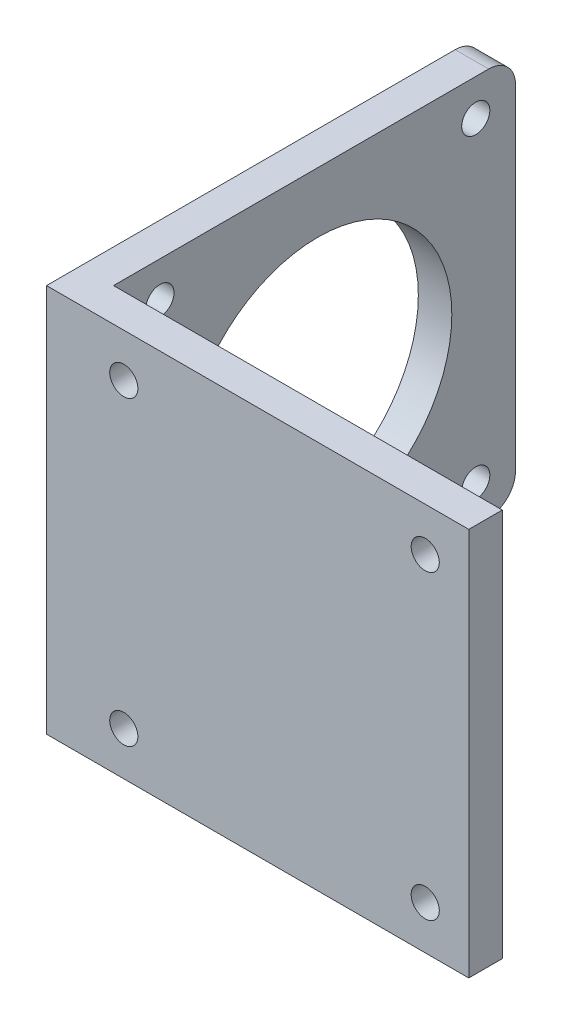
ISO-10303-21;
HEADER;
FILE_DESCRIPTION(('STEP AP214'),'2;1');
FILE_NAME('part.step','',(''),(''),'','','');
FILE_SCHEMA(('AUTOMOTIVE_DESIGN { 1 0 10303 214 1 1 1 1 }'));
ENDSEC;
DATA;
#1=APPLICATION_CONTEXT('core data for automotive mechanical design processes');
#2=APPLICATION_PROTOCOL_DEFINITION('international standard','automotive_design',2000,#1);
#3=PRODUCT_CONTEXT('',#1,'mechanical');
#4=PRODUCT('Part','Part','',(#3));
#5=PRODUCT_RELATED_PRODUCT_CATEGORY('part','',(#4));
#6=PRODUCT_DEFINITION_FORMATION('','',#4);
#7=PRODUCT_DEFINITION_CONTEXT('part definition',#1,'design');
#8=PRODUCT_DEFINITION('design','',#6,#7);
#9=PRODUCT_DEFINITION_SHAPE('','',#8);
#10=(LENGTH_UNIT() NAMED_UNIT(*) SI_UNIT(.MILLI.,.METRE.));
#11=(NAMED_UNIT(*) PLANE_ANGLE_UNIT() SI_UNIT($,.RADIAN.));
#12=(NAMED_UNIT(*) SI_UNIT($,.STERADIAN.) SOLID_ANGLE_UNIT());
#13=UNCERTAINTY_MEASURE_WITH_UNIT(LENGTH_MEASURE(1.E-05),#10,'distance_accuracy_value','');
#14=(GEOMETRIC_REPRESENTATION_CONTEXT(3) GLOBAL_UNCERTAINTY_ASSIGNED_CONTEXT((#13)) GLOBAL_UNIT_ASSIGNED_CONTEXT((#10,
#11,#12)) REPRESENTATION_CONTEXT('',''));
#15=CARTESIAN_POINT('',(0.,0.,0.));
#16=DIRECTION('',(0.,0.,1.));
#17=DIRECTION('',(1.,0.,0.));
#18=AXIS2_PLACEMENT_3D('',#15,#16,#17);
#19=CARTESIAN_POINT('',(63.0309944009184,58.,0.));
#20=DIRECTION('',(0.,0.,-1.));
#21=DIRECTION('',(-1.,0.,0.));
#22=AXIS2_PLACEMENT_3D('',#19,#20,#21);
#23=PLANE('',#22);
#24=CARTESIAN_POINT('',(11.5309944009184,6.49999999999999,0.));
#25=DIRECTION('',(0.,0.,1.));
#26=DIRECTION('',(1.,0.,0.));
#27=AXIS2_PLACEMENT_3D('',#24,#25,#26);
#28=CIRCLE('',#27,2.09999999999999);
#29=CARTESIAN_POINT('',(13.6309944009184,6.49999999999999,0.));
#30=VERTEX_POINT('',#29);
#31=EDGE_CURVE('E180',#30,#30,#28,.T.);
#32=ORIENTED_EDGE('',*,*,#31,.F.);
#33=EDGE_LOOP('',(#32));
#34=FACE_BOUND('',#33,.T.);
#35=CARTESIAN_POINT('',(11.5309944009184,51.5,0.));
#36=DIRECTION('',(0.,0.,1.));
#37=DIRECTION('',(1.,0.,0.));
#38=AXIS2_PLACEMENT_3D('',#35,#36,#37);
#39=CIRCLE('',#38,2.09999999999999);
#40=CARTESIAN_POINT('',(13.6309944009184,51.5,0.));
#41=VERTEX_POINT('',#40);
#42=EDGE_CURVE('E176',#41,#41,#39,.T.);
#43=ORIENTED_EDGE('',*,*,#42,.F.);
#44=EDGE_LOOP('',(#43));
#45=FACE_BOUND('',#44,.T.);
#46=CARTESIAN_POINT('',(56.5309944009184,51.5,0.));
#47=DIRECTION('',(0.,0.,1.));
#48=DIRECTION('',(1.,0.,0.));
#49=AXIS2_PLACEMENT_3D('',#46,#47,#48);
#50=CIRCLE('',#49,2.09999999999999);
#51=CARTESIAN_POINT('',(58.6309944009184,51.5,0.));
#52=VERTEX_POINT('',#51);
#53=EDGE_CURVE('E175',#52,#52,#50,.T.);
#54=ORIENTED_EDGE('',*,*,#53,.F.);
#55=EDGE_LOOP('',(#54));
#56=FACE_BOUND('',#55,.T.);
#57=CARTESIAN_POINT('',(56.5309944009184,6.5,0.));
#58=DIRECTION('',(0.,0.,1.));
#59=DIRECTION('',(1.,0.,0.));
#60=AXIS2_PLACEMENT_3D('',#57,#58,#59);
#61=CIRCLE('',#60,2.09999999999999);
#62=CARTESIAN_POINT('',(58.6309944009184,6.5,0.));
#63=VERTEX_POINT('',#62);
#64=EDGE_CURVE('E170',#63,#63,#61,.T.);
#65=ORIENTED_EDGE('',*,*,#64,.F.);
#66=EDGE_LOOP('',(#65));
#67=FACE_BOUND('',#66,.T.);
#68=DIRECTION('',(1.,0.,0.));
#69=VECTOR('',#68,1.);
#70=CARTESIAN_POINT('',(63.0309944009184,0.,0.));
#71=LINE('',#70,#69);
#72=CARTESIAN_POINT('',(0.,0.,0.));
#73=VERTEX_POINT('',#72);
#74=CARTESIAN_POINT('',(63.0309944009184,0.,0.));
#75=VERTEX_POINT('',#74);
#76=EDGE_CURVE('E152',#73,#75,#71,.T.);
#77=ORIENTED_EDGE('',*,*,#76,.T.);
#78=DIRECTION('',(0.,-1.,0.));
#79=VECTOR('',#78,1.);
#80=CARTESIAN_POINT('',(63.0309944009184,58.,0.));
#81=LINE('',#80,#79);
#82=CARTESIAN_POINT('',(63.0309944009184,58.,0.));
#83=VERTEX_POINT('',#82);
#84=EDGE_CURVE('E129',#83,#75,#81,.T.);
#85=ORIENTED_EDGE('',*,*,#84,.F.);
#86=DIRECTION('',(1.,0.,0.));
#87=VECTOR('',#86,1.);
#88=CARTESIAN_POINT('',(63.0309944009184,58.,0.));
#89=LINE('',#88,#87);
#90=CARTESIAN_POINT('',(0.,58.,0.));
#91=VERTEX_POINT('',#90);
#92=EDGE_CURVE('E137',#91,#83,#89,.T.);
#93=ORIENTED_EDGE('',*,*,#92,.F.);
#94=DIRECTION('',(0.,-1.,0.));
#95=VECTOR('',#94,1.);
#96=CARTESIAN_POINT('',(0.,58.,0.));
#97=LINE('',#96,#95);
#98=EDGE_CURVE('E218',#91,#73,#97,.T.);
#99=ORIENTED_EDGE('',*,*,#98,.T.);
#100=EDGE_LOOP('',(#77,#85,#93,#99));
#101=FACE_BOUND('',#100,.T.);
#102=ADVANCED_FACE('F42',(#34,#45,#56,#67,#101),#23,.F.);
#103=CARTESIAN_POINT('',(63.0309944009184,58.,-5.));
#104=DIRECTION('',(-1.,0.,0.));
#105=DIRECTION('',(0.,0.,1.));
#106=AXIS2_PLACEMENT_3D('',#103,#104,#105);
#107=PLANE('',#106);
#108=DIRECTION('',(0.,0.,-1.));
#109=VECTOR('',#108,1.);
#110=CARTESIAN_POINT('',(63.0309944009184,0.,-5.));
#111=LINE('',#110,#109);
#112=CARTESIAN_POINT('',(63.0309944009184,0.,-5.));
#113=VERTEX_POINT('',#112);
#114=EDGE_CURVE('E237',#75,#113,#111,.T.);
#115=ORIENTED_EDGE('',*,*,#114,.T.);
#116=DIRECTION('',(0.,-1.,0.));
#117=VECTOR('',#116,1.);
#118=CARTESIAN_POINT('',(63.0309944009184,58.,-5.));
#119=LINE('',#118,#117);
#120=CARTESIAN_POINT('',(63.0309944009184,58.,-5.));
#121=VERTEX_POINT('',#120);
#122=EDGE_CURVE('E132',#121,#113,#119,.T.);
#123=ORIENTED_EDGE('',*,*,#122,.F.);
#124=DIRECTION('',(0.,0.,-1.));
#125=VECTOR('',#124,1.);
#126=CARTESIAN_POINT('',(63.0309944009184,58.,-5.));
#127=LINE('',#126,#125);
#128=EDGE_CURVE('E125',#83,#121,#127,.T.);
#129=ORIENTED_EDGE('',*,*,#128,.F.);
#130=ORIENTED_EDGE('',*,*,#84,.T.);
#131=EDGE_LOOP('',(#115,#123,#129,#130));
#132=FACE_BOUND('',#131,.T.);
#133=ADVANCED_FACE('F127',(#132),#107,.F.);
#134=CARTESIAN_POINT('',(5.00000000000001,58.,-5.));
#135=DIRECTION('',(0.,0.,1.));
#136=DIRECTION('',(1.,0.,0.));
#137=AXIS2_PLACEMENT_3D('',#134,#135,#136);
#138=PLANE('',#137);
#139=CARTESIAN_POINT('',(11.5309944009184,6.49999999999999,-5.));
#140=DIRECTION('',(0.,0.,1.));
#141=DIRECTION('',(1.,0.,0.));
#142=AXIS2_PLACEMENT_3D('',#139,#140,#141);
#143=CIRCLE('',#142,2.09999999999999);
#144=CARTESIAN_POINT('',(13.6309944009184,6.49999999999999,-5.));
#145=VERTEX_POINT('',#144);
#146=EDGE_CURVE('E177',#145,#145,#143,.T.);
#147=ORIENTED_EDGE('',*,*,#146,.T.);
#148=EDGE_LOOP('',(#147));
#149=FACE_BOUND('',#148,.T.);
#150=CARTESIAN_POINT('',(11.5309944009184,51.5,-5.));
#151=DIRECTION('',(0.,0.,1.));
#152=DIRECTION('',(1.,0.,0.));
#153=AXIS2_PLACEMENT_3D('',#150,#151,#152);
#154=CIRCLE('',#153,2.09999999999999);
#155=CARTESIAN_POINT('',(13.6309944009184,51.5,-5.));
#156=VERTEX_POINT('',#155);
#157=EDGE_CURVE('E171',#156,#156,#154,.T.);
#158=ORIENTED_EDGE('',*,*,#157,.T.);
#159=EDGE_LOOP('',(#158));
#160=FACE_BOUND('',#159,.T.);
#161=CARTESIAN_POINT('',(56.5309944009184,51.5,-5.));
#162=DIRECTION('',(0.,0.,1.));
#163=DIRECTION('',(1.,0.,0.));
#164=AXIS2_PLACEMENT_3D('',#161,#162,#163);
#165=CIRCLE('',#164,2.09999999999999);
#166=CARTESIAN_POINT('',(58.6309944009184,51.5,-5.));
#167=VERTEX_POINT('',#166);
#168=EDGE_CURVE('E257',#167,#167,#165,.T.);
#169=ORIENTED_EDGE('',*,*,#168,.T.);
#170=EDGE_LOOP('',(#169));
#171=FACE_BOUND('',#170,.T.);
#172=CARTESIAN_POINT('',(56.5309944009184,6.5,-5.));
#173=DIRECTION('',(0.,0.,1.));
#174=DIRECTION('',(1.,0.,0.));
#175=AXIS2_PLACEMENT_3D('',#172,#173,#174);
#176=CIRCLE('',#175,2.09999999999999);
#177=CARTESIAN_POINT('',(58.6309944009184,6.5,-5.));
#178=VERTEX_POINT('',#177);
#179=EDGE_CURVE('E165',#178,#178,#176,.T.);
#180=ORIENTED_EDGE('',*,*,#179,.T.);
#181=EDGE_LOOP('',(#180));
#182=FACE_BOUND('',#181,.T.);
#183=DIRECTION('',(-1.,0.,0.));
#184=VECTOR('',#183,1.);
#185=CARTESIAN_POINT('',(5.00000000000001,0.,-5.));
#186=LINE('',#185,#184);
#187=CARTESIAN_POINT('',(5.00000000000001,0.,-5.));
#188=VERTEX_POINT('',#187);
#189=EDGE_CURVE('E231',#113,#188,#186,.T.);
#190=ORIENTED_EDGE('',*,*,#189,.T.);
#191=DIRECTION('',(0.,-1.,0.));
#192=VECTOR('',#191,1.);
#193=CARTESIAN_POINT('',(5.00000000000001,58.,-5.));
#194=LINE('',#193,#192);
#195=CARTESIAN_POINT('',(5.00000000000001,58.,-5.));
#196=VERTEX_POINT('',#195);
#197=EDGE_CURVE('E161',#196,#188,#194,.T.);
#198=ORIENTED_EDGE('',*,*,#197,.F.);
#199=DIRECTION('',(-1.,0.,0.));
#200=VECTOR('',#199,1.);
#201=CARTESIAN_POINT('',(5.00000000000001,58.,-5.));
#202=LINE('',#201,#200);
#203=EDGE_CURVE('E136',#121,#196,#202,.T.);
#204=ORIENTED_EDGE('',*,*,#203,.F.);
#205=ORIENTED_EDGE('',*,*,#122,.T.);
#206=EDGE_LOOP('',(#190,#198,#204,#205));
#207=FACE_BOUND('',#206,.T.);
#208=ADVANCED_FACE('F323',(#149,#160,#171,#182,#207),#138,.F.);
#209=CARTESIAN_POINT('',(5.,58.,-65.));
#210=DIRECTION('',(-1.,0.,0.));
#211=DIRECTION('',(0.,0.,1.));
#212=AXIS2_PLACEMENT_3D('',#209,#210,#211);
#213=PLANE('',#212);
#214=CARTESIAN_POINT('',(5.,5.42682768219347,-11.9268276821935));
#215=DIRECTION('',(-1.,0.,0.));
#216=DIRECTION('',(0.,0.,1.));
#217=AXIS2_PLACEMENT_3D('',#214,#215,#216);
#218=CIRCLE('',#217,2.09999999999999);
#219=CARTESIAN_POINT('',(5.,5.42682768219347,-9.82682768219349));
#220=VERTEX_POINT('',#219);
#221=EDGE_CURVE('E292',#220,#220,#218,.T.);
#222=ORIENTED_EDGE('',*,*,#221,.T.);
#223=EDGE_LOOP('',(#222));
#224=FACE_BOUND('',#223,.T.);
#225=CARTESIAN_POINT('',(5.,52.5731723178065,-11.9268276821935));
#226=DIRECTION('',(-1.,0.,0.));
#227=DIRECTION('',(0.,0.,1.));
#228=AXIS2_PLACEMENT_3D('',#225,#226,#227);
#229=CIRCLE('',#228,2.09999999999999);
#230=CARTESIAN_POINT('',(5.,52.5731723178065,-9.82682768219349));
#231=VERTEX_POINT('',#230);
#232=EDGE_CURVE('E285',#231,#231,#229,.T.);
#233=ORIENTED_EDGE('',*,*,#232,.T.);
#234=EDGE_LOOP('',(#233));
#235=FACE_BOUND('',#234,.T.);
#236=CARTESIAN_POINT('',(5.,52.5731723178065,-59.0731723178065));
#237=DIRECTION('',(-1.,0.,0.));
#238=DIRECTION('',(0.,0.,1.));
#239=AXIS2_PLACEMENT_3D('',#236,#237,#238);
#240=CIRCLE('',#239,2.09999999999999);
#241=CARTESIAN_POINT('',(5.,52.5731723178065,-56.9731723178066));
#242=VERTEX_POINT('',#241);
#243=EDGE_CURVE('E277',#242,#242,#240,.T.);
#244=ORIENTED_EDGE('',*,*,#243,.T.);
#245=EDGE_LOOP('',(#244));
#246=FACE_BOUND('',#245,.T.);
#247=CARTESIAN_POINT('',(5.,5.42682768219347,-59.0731723178065));
#248=DIRECTION('',(-1.,0.,0.));
#249=DIRECTION('',(0.,0.,1.));
#250=AXIS2_PLACEMENT_3D('',#247,#248,#249);
#251=CIRCLE('',#250,2.09999999999999);
#252=CARTESIAN_POINT('',(5.,5.42682768219347,-56.9731723178066));
#253=VERTEX_POINT('',#252);
#254=EDGE_CURVE('E270',#253,#253,#251,.T.);
#255=ORIENTED_EDGE('',*,*,#254,.T.);
#256=EDGE_LOOP('',(#255));
#257=FACE_BOUND('',#256,.T.);
#258=CARTESIAN_POINT('',(5.,29.,-35.5));
#259=DIRECTION('',(-1.,0.,0.));
#260=DIRECTION('',(0.,0.,1.));
#261=AXIS2_PLACEMENT_3D('',#258,#259,#260);
#262=CIRCLE('',#261,20.);
#263=CARTESIAN_POINT('',(5.,29.,-15.5));
#264=VERTEX_POINT('',#263);
#265=EDGE_CURVE('E169',#264,#264,#262,.T.);
#266=ORIENTED_EDGE('',*,*,#265,.T.);
#267=EDGE_LOOP('',(#266));
#268=FACE_BOUND('',#267,.T.);
#269=DIRECTION('',(0.,-1.,0.));
#270=VECTOR('',#269,1.);
#271=CARTESIAN_POINT('',(5.,58.,-65.));
#272=LINE('',#271,#270);
#273=CARTESIAN_POINT('',(5.,54.,-65.));
#274=VERTEX_POINT('',#273);
#275=CARTESIAN_POINT('',(5.,4.00000000000001,-65.));
#276=VERTEX_POINT('',#275);
#277=EDGE_CURVE('E202',#274,#276,#272,.T.);
#278=ORIENTED_EDGE('',*,*,#277,.F.);
#279=CARTESIAN_POINT('',(5.,54.,-61.));
#280=DIRECTION('',(-1.,0.,0.));
#281=DIRECTION('',(0.,0.,1.));
#282=AXIS2_PLACEMENT_3D('',#279,#280,#281);
#283=CIRCLE('',#282,4.);
#284=CARTESIAN_POINT('',(5.,58.,-61.));
#285=VERTEX_POINT('',#284);
#286=EDGE_CURVE('E51',#274,#285,#283,.F.);
#287=ORIENTED_EDGE('',*,*,#286,.T.);
#288=DIRECTION('',(0.,0.,-1.));
#289=VECTOR('',#288,1.);
#290=CARTESIAN_POINT('',(5.,58.,-65.));
#291=LINE('',#290,#289);
#292=EDGE_CURVE('E201',#196,#285,#291,.T.);
#293=ORIENTED_EDGE('',*,*,#292,.F.);
#294=ORIENTED_EDGE('',*,*,#197,.T.);
#295=DIRECTION('',(0.,0.,-1.));
#296=VECTOR('',#295,1.);
#297=CARTESIAN_POINT('',(5.,0.,-65.));
#298=LINE('',#297,#296);
#299=CARTESIAN_POINT('',(5.,0.,-61.));
#300=VERTEX_POINT('',#299);
#301=EDGE_CURVE('E227',#188,#300,#298,.T.);
#302=ORIENTED_EDGE('',*,*,#301,.T.);
#303=CARTESIAN_POINT('',(5.,4.,-61.));
#304=DIRECTION('',(-1.,0.,0.));
#305=DIRECTION('',(0.,0.,1.));
#306=AXIS2_PLACEMENT_3D('',#303,#304,#305);
#307=CIRCLE('',#306,4.);
#308=EDGE_CURVE('E67',#300,#276,#307,.F.);
#309=ORIENTED_EDGE('',*,*,#308,.T.);
#310=EDGE_LOOP('',(#278,#287,#293,#294,#302,#309));
#311=FACE_BOUND('',#310,.T.);
#312=ADVANCED_FACE('F199',(#224,#235,#246,#257,#268,#311),#213,.F.);
#313=CARTESIAN_POINT('',(0.,58.,-65.));
#314=DIRECTION('',(0.,0.,1.));
#315=DIRECTION('',(1.,0.,0.));
#316=AXIS2_PLACEMENT_3D('',#313,#314,#315);
#317=PLANE('',#316);
#318=DIRECTION('',(0.,-1.,0.));
#319=VECTOR('',#318,1.);
#320=CARTESIAN_POINT('',(0.,58.,-65.));
#321=LINE('',#320,#319);
#322=CARTESIAN_POINT('',(0.,54.,-65.));
#323=VERTEX_POINT('',#322);
#324=CARTESIAN_POINT('',(0.,4.00000000000001,-65.));
#325=VERTEX_POINT('',#324);
#326=EDGE_CURVE('E214',#323,#325,#321,.T.);
#327=ORIENTED_EDGE('',*,*,#326,.F.);
#328=DIRECTION('',(-1.,0.,0.));
#329=VECTOR('',#328,1.);
#330=CARTESIAN_POINT('',(0.,54.,-65.));
#331=LINE('',#330,#329);
#332=EDGE_CURVE('E191',#323,#274,#331,.F.);
#333=ORIENTED_EDGE('',*,*,#332,.T.);
#334=ORIENTED_EDGE('',*,*,#277,.T.);
#335=DIRECTION('',(-1.,0.,0.));
#336=VECTOR('',#335,1.);
#337=CARTESIAN_POINT('',(0.,4.,-65.));
#338=LINE('',#337,#336);
#339=EDGE_CURVE('E187',#276,#325,#338,.T.);
#340=ORIENTED_EDGE('',*,*,#339,.T.);
#341=EDGE_LOOP('',(#327,#333,#334,#340));
#342=FACE_BOUND('',#341,.T.);
#343=ADVANCED_FACE('F216',(#342),#317,.F.);
#344=CARTESIAN_POINT('',(0.,58.,0.));
#345=DIRECTION('',(1.,0.,0.));
#346=DIRECTION('',(0.,0.,-1.));
#347=AXIS2_PLACEMENT_3D('',#344,#345,#346);
#348=PLANE('',#347);
#349=CARTESIAN_POINT('',(0.,5.42682768219347,-11.9268276821935));
#350=DIRECTION('',(-1.,0.,0.));
#351=DIRECTION('',(0.,0.,1.));
#352=AXIS2_PLACEMENT_3D('',#349,#350,#351);
#353=CIRCLE('',#352,2.09999999999999);
#354=CARTESIAN_POINT('',(0.,5.42682768219347,-9.82682768219349));
#355=VERTEX_POINT('',#354);
#356=EDGE_CURVE('E296',#355,#355,#353,.T.);
#357=ORIENTED_EDGE('',*,*,#356,.F.);
#358=EDGE_LOOP('',(#357));
#359=FACE_BOUND('',#358,.T.);
#360=CARTESIAN_POINT('',(0.,52.5731723178065,-11.9268276821935));
#361=DIRECTION('',(-1.,0.,0.));
#362=DIRECTION('',(0.,0.,1.));
#363=AXIS2_PLACEMENT_3D('',#360,#361,#362);
#364=CIRCLE('',#363,2.09999999999999);
#365=CARTESIAN_POINT('',(0.,52.5731723178065,-9.82682768219349));
#366=VERTEX_POINT('',#365);
#367=EDGE_CURVE('E288',#366,#366,#364,.T.);
#368=ORIENTED_EDGE('',*,*,#367,.F.);
#369=EDGE_LOOP('',(#368));
#370=FACE_BOUND('',#369,.T.);
#371=CARTESIAN_POINT('',(0.,52.5731723178065,-59.0731723178065));
#372=DIRECTION('',(-1.,0.,0.));
#373=DIRECTION('',(0.,0.,1.));
#374=AXIS2_PLACEMENT_3D('',#371,#372,#373);
#375=CIRCLE('',#374,2.09999999999999);
#376=CARTESIAN_POINT('',(0.,52.5731723178065,-56.9731723178065));
#377=VERTEX_POINT('',#376);
#378=EDGE_CURVE('E281',#377,#377,#375,.T.);
#379=ORIENTED_EDGE('',*,*,#378,.F.);
#380=EDGE_LOOP('',(#379));
#381=FACE_BOUND('',#380,.T.);
#382=CARTESIAN_POINT('',(0.,5.42682768219347,-59.0731723178065));
#383=DIRECTION('',(-1.,0.,0.));
#384=DIRECTION('',(0.,0.,1.));
#385=AXIS2_PLACEMENT_3D('',#382,#383,#384);
#386=CIRCLE('',#385,2.09999999999999);
#387=CARTESIAN_POINT('',(0.,5.42682768219347,-56.9731723178066));
#388=VERTEX_POINT('',#387);
#389=EDGE_CURVE('E273',#388,#388,#386,.T.);
#390=ORIENTED_EDGE('',*,*,#389,.F.);
#391=EDGE_LOOP('',(#390));
#392=FACE_BOUND('',#391,.T.);
#393=CARTESIAN_POINT('',(0.,29.,-35.5));
#394=DIRECTION('',(-1.,0.,0.));
#395=DIRECTION('',(0.,0.,1.));
#396=AXIS2_PLACEMENT_3D('',#393,#394,#395);
#397=CIRCLE('',#396,20.);
#398=CARTESIAN_POINT('',(0.,29.,-15.5));
#399=VERTEX_POINT('',#398);
#400=EDGE_CURVE('E244',#399,#399,#397,.T.);
#401=ORIENTED_EDGE('',*,*,#400,.F.);
#402=EDGE_LOOP('',(#401));
#403=FACE_BOUND('',#402,.T.);
#404=DIRECTION('',(0.,0.,1.));
#405=VECTOR('',#404,1.);
#406=CARTESIAN_POINT('',(0.,58.,0.));
#407=LINE('',#406,#405);
#408=CARTESIAN_POINT('',(0.,58.,-61.));
#409=VERTEX_POINT('',#408);
#410=EDGE_CURVE('E144',#409,#91,#407,.T.);
#411=ORIENTED_EDGE('',*,*,#410,.F.);
#412=CARTESIAN_POINT('',(0.,54.,-61.));
#413=DIRECTION('',(1.,0.,0.));
#414=DIRECTION('',(0.,0.,-1.));
#415=AXIS2_PLACEMENT_3D('',#412,#413,#414);
#416=CIRCLE('',#415,4.);
#417=EDGE_CURVE('E184',#409,#323,#416,.F.);
#418=ORIENTED_EDGE('',*,*,#417,.T.);
#419=ORIENTED_EDGE('',*,*,#326,.T.);
#420=CARTESIAN_POINT('',(0.,4.,-61.));
#421=DIRECTION('',(1.,0.,0.));
#422=DIRECTION('',(0.,0.,-1.));
#423=AXIS2_PLACEMENT_3D('',#420,#421,#422);
#424=CIRCLE('',#423,4.);
#425=CARTESIAN_POINT('',(0.,0.,-61.));
#426=VERTEX_POINT('',#425);
#427=EDGE_CURVE('E158',#325,#426,#424,.F.);
#428=ORIENTED_EDGE('',*,*,#427,.T.);
#429=DIRECTION('',(0.,0.,1.));
#430=VECTOR('',#429,1.);
#431=CARTESIAN_POINT('',(0.,0.,0.));
#432=LINE('',#431,#430);
#433=EDGE_CURVE('E149',#426,#73,#432,.T.);
#434=ORIENTED_EDGE('',*,*,#433,.T.);
#435=ORIENTED_EDGE('',*,*,#98,.F.);
#436=EDGE_LOOP('',(#411,#418,#419,#428,#434,#435));
#437=FACE_BOUND('',#436,.T.);
#438=ADVANCED_FACE('F213',(#359,#370,#381,#392,#403,#437),#348,.F.);
#439=CARTESIAN_POINT('',(0.,58.,0.));
#440=DIRECTION('',(0.,-1.,0.));
#441=DIRECTION('',(0.,0.,-1.));
#442=AXIS2_PLACEMENT_3D('',#439,#440,#441);
#443=PLANE('',#442);
#444=ORIENTED_EDGE('',*,*,#292,.T.);
#445=DIRECTION('',(-1.,0.,0.));
#446=VECTOR('',#445,1.);
#447=CARTESIAN_POINT('',(0.,58.,-61.));
#448=LINE('',#447,#446);
#449=EDGE_CURVE('E154',#285,#409,#448,.T.);
#450=ORIENTED_EDGE('',*,*,#449,.T.);
#451=ORIENTED_EDGE('',*,*,#410,.T.);
#452=ORIENTED_EDGE('',*,*,#92,.T.);
#453=ORIENTED_EDGE('',*,*,#128,.T.);
#454=ORIENTED_EDGE('',*,*,#203,.T.);
#455=EDGE_LOOP('',(#444,#450,#451,#452,#453,#454));
#456=FACE_BOUND('',#455,.T.);
#457=ADVANCED_FACE('F141',(#456),#443,.F.);
#458=CARTESIAN_POINT('',(0.,0.,0.));
#459=DIRECTION('',(0.,-1.,0.));
#460=DIRECTION('',(0.,0.,-1.));
#461=AXIS2_PLACEMENT_3D('',#458,#459,#460);
#462=PLANE('',#461);
#463=ORIENTED_EDGE('',*,*,#433,.F.);
#464=DIRECTION('',(-1.,0.,0.));
#465=VECTOR('',#464,1.);
#466=CARTESIAN_POINT('',(5.,0.,-61.));
#467=LINE('',#466,#465);
#468=EDGE_CURVE('E11',#426,#300,#467,.F.);
#469=ORIENTED_EDGE('',*,*,#468,.T.);
#470=ORIENTED_EDGE('',*,*,#301,.F.);
#471=ORIENTED_EDGE('',*,*,#189,.F.);
#472=ORIENTED_EDGE('',*,*,#114,.F.);
#473=ORIENTED_EDGE('',*,*,#76,.F.);
#474=EDGE_LOOP('',(#463,#469,#470,#471,#472,#473));
#475=FACE_BOUND('',#474,.T.);
#476=ADVANCED_FACE('F230',(#475),#462,.T.);
#477=CARTESIAN_POINT('',(0.,29.,-35.5));
#478=DIRECTION('',(1.,0.,0.));
#479=DIRECTION('',(0.,0.,-1.));
#480=AXIS2_PLACEMENT_3D('',#477,#478,#479);
#481=CYLINDRICAL_SURFACE('',#480,20.);
#482=ORIENTED_EDGE('',*,*,#400,.T.);
#483=EDGE_LOOP('',(#482));
#484=FACE_BOUND('',#483,.T.);
#485=ORIENTED_EDGE('',*,*,#265,.F.);
#486=EDGE_LOOP('',(#485));
#487=FACE_BOUND('',#486,.T.);
#488=ADVANCED_FACE('F315',(#484,#487),#481,.F.);
#489=CARTESIAN_POINT('',(56.5309944009184,6.5,0.));
#490=DIRECTION('',(0.,0.,1.));
#491=DIRECTION('',(1.,0.,0.));
#492=AXIS2_PLACEMENT_3D('',#489,#490,#491);
#493=CYLINDRICAL_SURFACE('',#492,2.09999999999999);
#494=ORIENTED_EDGE('',*,*,#64,.T.);
#495=EDGE_LOOP('',(#494));
#496=FACE_BOUND('',#495,.T.);
#497=ORIENTED_EDGE('',*,*,#179,.F.);
#498=EDGE_LOOP('',(#497));
#499=FACE_BOUND('',#498,.T.);
#500=ADVANCED_FACE('F318',(#496,#499),#493,.F.);
#501=CARTESIAN_POINT('',(56.5309944009184,51.5,0.));
#502=DIRECTION('',(0.,0.,1.));
#503=DIRECTION('',(1.,0.,0.));
#504=AXIS2_PLACEMENT_3D('',#501,#502,#503);
#505=CYLINDRICAL_SURFACE('',#504,2.09999999999999);
#506=ORIENTED_EDGE('',*,*,#53,.T.);
#507=EDGE_LOOP('',(#506));
#508=FACE_BOUND('',#507,.T.);
#509=ORIENTED_EDGE('',*,*,#168,.F.);
#510=EDGE_LOOP('',(#509));
#511=FACE_BOUND('',#510,.T.);
#512=ADVANCED_FACE('F372',(#508,#511),#505,.F.);
#513=CARTESIAN_POINT('',(11.5309944009184,51.5,0.));
#514=DIRECTION('',(0.,0.,1.));
#515=DIRECTION('',(1.,0.,0.));
#516=AXIS2_PLACEMENT_3D('',#513,#514,#515);
#517=CYLINDRICAL_SURFACE('',#516,2.09999999999999);
#518=ORIENTED_EDGE('',*,*,#42,.T.);
#519=EDGE_LOOP('',(#518));
#520=FACE_BOUND('',#519,.T.);
#521=ORIENTED_EDGE('',*,*,#157,.F.);
#522=EDGE_LOOP('',(#521));
#523=FACE_BOUND('',#522,.T.);
#524=ADVANCED_FACE('F368',(#520,#523),#517,.F.);
#525=CARTESIAN_POINT('',(11.5309944009184,6.49999999999999,0.));
#526=DIRECTION('',(0.,0.,1.));
#527=DIRECTION('',(1.,0.,0.));
#528=AXIS2_PLACEMENT_3D('',#525,#526,#527);
#529=CYLINDRICAL_SURFACE('',#528,2.09999999999999);
#530=ORIENTED_EDGE('',*,*,#31,.T.);
#531=EDGE_LOOP('',(#530));
#532=FACE_BOUND('',#531,.T.);
#533=ORIENTED_EDGE('',*,*,#146,.F.);
#534=EDGE_LOOP('',(#533));
#535=FACE_BOUND('',#534,.T.);
#536=ADVANCED_FACE('F364',(#532,#535),#529,.F.);
#537=CARTESIAN_POINT('',(0.,5.42682768219347,-59.0731723178065));
#538=DIRECTION('',(-1.,0.,0.));
#539=DIRECTION('',(0.,0.,1.));
#540=AXIS2_PLACEMENT_3D('',#537,#538,#539);
#541=CYLINDRICAL_SURFACE('',#540,2.09999999999999);
#542=ORIENTED_EDGE('',*,*,#389,.T.);
#543=EDGE_LOOP('',(#542));
#544=FACE_BOUND('',#543,.T.);
#545=ORIENTED_EDGE('',*,*,#254,.F.);
#546=EDGE_LOOP('',(#545));
#547=FACE_BOUND('',#546,.T.);
#548=ADVANCED_FACE('F360',(#544,#547),#541,.F.);
#549=CARTESIAN_POINT('',(0.,52.5731723178065,-59.0731723178065));
#550=DIRECTION('',(-1.,0.,0.));
#551=DIRECTION('',(0.,0.,1.));
#552=AXIS2_PLACEMENT_3D('',#549,#550,#551);
#553=CYLINDRICAL_SURFACE('',#552,2.09999999999999);
#554=ORIENTED_EDGE('',*,*,#378,.T.);
#555=EDGE_LOOP('',(#554));
#556=FACE_BOUND('',#555,.T.);
#557=ORIENTED_EDGE('',*,*,#243,.F.);
#558=EDGE_LOOP('',(#557));
#559=FACE_BOUND('',#558,.T.);
#560=ADVANCED_FACE('F354',(#556,#559),#553,.F.);
#561=CARTESIAN_POINT('',(0.,52.5731723178065,-11.9268276821935));
#562=DIRECTION('',(-1.,0.,0.));
#563=DIRECTION('',(0.,0.,1.));
#564=AXIS2_PLACEMENT_3D('',#561,#562,#563);
#565=CYLINDRICAL_SURFACE('',#564,2.09999999999999);
#566=ORIENTED_EDGE('',*,*,#367,.T.);
#567=EDGE_LOOP('',(#566));
#568=FACE_BOUND('',#567,.T.);
#569=ORIENTED_EDGE('',*,*,#232,.F.);
#570=EDGE_LOOP('',(#569));
#571=FACE_BOUND('',#570,.T.);
#572=ADVANCED_FACE('F349',(#568,#571),#565,.F.);
#573=CARTESIAN_POINT('',(0.,5.42682768219347,-11.9268276821935));
#574=DIRECTION('',(-1.,0.,0.));
#575=DIRECTION('',(0.,0.,1.));
#576=AXIS2_PLACEMENT_3D('',#573,#574,#575);
#577=CYLINDRICAL_SURFACE('',#576,2.09999999999999);
#578=ORIENTED_EDGE('',*,*,#356,.T.);
#579=EDGE_LOOP('',(#578));
#580=FACE_BOUND('',#579,.T.);
#581=ORIENTED_EDGE('',*,*,#221,.F.);
#582=EDGE_LOOP('',(#581));
#583=FACE_BOUND('',#582,.T.);
#584=ADVANCED_FACE('F301',(#580,#583),#577,.F.);
#585=CARTESIAN_POINT('',(0.,54.,-61.));
#586=DIRECTION('',(-1.,0.,0.));
#587=DIRECTION('',(0.,0.,1.));
#588=AXIS2_PLACEMENT_3D('',#585,#586,#587);
#589=CYLINDRICAL_SURFACE('',#588,4.);
#590=ORIENTED_EDGE('',*,*,#286,.F.);
#591=ORIENTED_EDGE('',*,*,#332,.F.);
#592=ORIENTED_EDGE('',*,*,#417,.F.);
#593=ORIENTED_EDGE('',*,*,#449,.F.);
#594=EDGE_LOOP('',(#590,#591,#592,#593));
#595=FACE_BOUND('',#594,.T.);
#596=ADVANCED_FACE('F209',(#595),#589,.T.);
#597=CARTESIAN_POINT('',(0.,4.,-61.));
#598=DIRECTION('',(1.,0.,0.));
#599=DIRECTION('',(0.,0.,-1.));
#600=AXIS2_PLACEMENT_3D('',#597,#598,#599);
#601=CYLINDRICAL_SURFACE('',#600,4.);
#602=ORIENTED_EDGE('',*,*,#308,.F.);
#603=ORIENTED_EDGE('',*,*,#468,.F.);
#604=ORIENTED_EDGE('',*,*,#427,.F.);
#605=ORIENTED_EDGE('',*,*,#339,.F.);
#606=EDGE_LOOP('',(#602,#603,#604,#605));
#607=FACE_BOUND('',#606,.T.);
#608=ADVANCED_FACE('F44',(#607),#601,.T.);
#609=CLOSED_SHELL('',(#102,#133,#208,#312,#343,#438,#457,#476,#488,#500,#512,#524,#536,#548,
#560,#572,#584,#596,#608));
#610=MANIFOLD_SOLID_BREP('B2',#609);
#611=ADVANCED_BREP_SHAPE_REPRESENTATION('',(#18,#610),#14);
#612=SHAPE_DEFINITION_REPRESENTATION(#9,#611);
ENDSEC;
END-ISO-10303-21;
